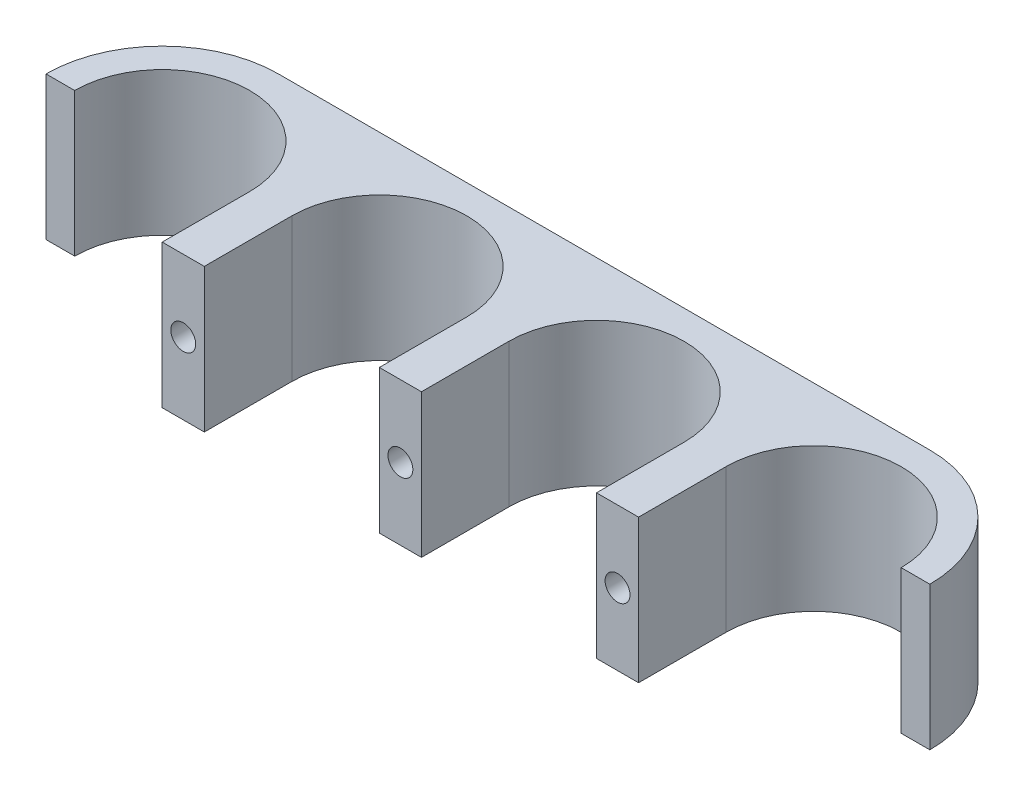
ISO-10303-21;
HEADER;
FILE_DESCRIPTION(('STEP AP214'),'2;1');
FILE_NAME('part.step','',(''),(''),'','','');
FILE_SCHEMA(('AUTOMOTIVE_DESIGN { 1 0 10303 214 1 1 1 1 }'));
ENDSEC;
DATA;
#1=APPLICATION_CONTEXT('core data for automotive mechanical design processes');
#2=APPLICATION_PROTOCOL_DEFINITION('international standard','automotive_design',2000,#1);
#3=PRODUCT_CONTEXT('',#1,'mechanical');
#4=PRODUCT('Part','Part','',(#3));
#5=PRODUCT_RELATED_PRODUCT_CATEGORY('part','',(#4));
#6=PRODUCT_DEFINITION_FORMATION('','',#4);
#7=PRODUCT_DEFINITION_CONTEXT('part definition',#1,'design');
#8=PRODUCT_DEFINITION('design','',#6,#7);
#9=PRODUCT_DEFINITION_SHAPE('','',#8);
#10=(LENGTH_UNIT() NAMED_UNIT(*) SI_UNIT(.MILLI.,.METRE.));
#11=(NAMED_UNIT(*) PLANE_ANGLE_UNIT() SI_UNIT($,.RADIAN.));
#12=(NAMED_UNIT(*) SI_UNIT($,.STERADIAN.) SOLID_ANGLE_UNIT());
#13=UNCERTAINTY_MEASURE_WITH_UNIT(LENGTH_MEASURE(1.E-05),#10,'distance_accuracy_value','');
#14=(GEOMETRIC_REPRESENTATION_CONTEXT(3) GLOBAL_UNCERTAINTY_ASSIGNED_CONTEXT((#13)) GLOBAL_UNIT_ASSIGNED_CONTEXT((#10,
#11,#12)) REPRESENTATION_CONTEXT('',''));
#15=CARTESIAN_POINT('',(0.,0.,0.));
#16=DIRECTION('',(0.,0.,1.));
#17=DIRECTION('',(1.,0.,0.));
#18=AXIS2_PLACEMENT_3D('',#15,#16,#17);
#19=CARTESIAN_POINT('',(11.35,15.,0.));
#20=DIRECTION('',(0.,-1.,0.));
#21=DIRECTION('',(0.,0.,-1.));
#22=AXIS2_PLACEMENT_3D('',#19,#20,#21);
#23=CYLINDRICAL_SURFACE('',#22,9.15);
#24=CARTESIAN_POINT('',(11.35,0.,0.));
#25=DIRECTION('',(0.,-1.,0.));
#26=DIRECTION('',(0.,0.,-1.));
#27=AXIS2_PLACEMENT_3D('',#24,#25,#26);
#28=CIRCLE('',#27,9.15);
#29=CARTESIAN_POINT('',(2.2,0.,0.));
#30=VERTEX_POINT('',#29);
#31=CARTESIAN_POINT('',(20.5,0.,0.));
#32=VERTEX_POINT('',#31);
#33=EDGE_CURVE('E189',#30,#32,#28,.T.);
#34=ORIENTED_EDGE('',*,*,#33,.T.);
#35=DIRECTION('',(0.,-1.,0.));
#36=VECTOR('',#35,1.);
#37=CARTESIAN_POINT('',(20.5,15.,0.));
#38=LINE('',#37,#36);
#39=CARTESIAN_POINT('',(20.5,15.,0.));
#40=VERTEX_POINT('',#39);
#41=EDGE_CURVE('E11',#40,#32,#38,.T.);
#42=ORIENTED_EDGE('',*,*,#41,.F.);
#43=CARTESIAN_POINT('',(11.35,15.,0.));
#44=DIRECTION('',(0.,-1.,0.));
#45=DIRECTION('',(0.,0.,-1.));
#46=AXIS2_PLACEMENT_3D('',#43,#44,#45);
#47=CIRCLE('',#46,9.15);
#48=CARTESIAN_POINT('',(2.2,15.,0.));
#49=VERTEX_POINT('',#48);
#50=EDGE_CURVE('E224',#49,#40,#47,.T.);
#51=ORIENTED_EDGE('',*,*,#50,.F.);
#52=DIRECTION('',(0.,-1.,0.));
#53=VECTOR('',#52,1.);
#54=CARTESIAN_POINT('',(2.2,15.,0.));
#55=LINE('',#54,#53);
#56=EDGE_CURVE('E185',#49,#30,#55,.T.);
#57=ORIENTED_EDGE('',*,*,#56,.T.);
#58=EDGE_LOOP('',(#34,#42,#51,#57));
#59=FACE_BOUND('',#58,.T.);
#60=ADVANCED_FACE('F33',(#59),#23,.F.);
#61=CARTESIAN_POINT('',(20.5,15.,0.));
#62=DIRECTION('',(1.,0.,0.));
#63=DIRECTION('',(0.,0.,-1.));
#64=AXIS2_PLACEMENT_3D('',#61,#62,#63);
#65=PLANE('',#64);
#66=DIRECTION('',(0.,0.,1.));
#67=VECTOR('',#66,1.);
#68=CARTESIAN_POINT('',(20.5,0.,0.));
#69=LINE('',#68,#67);
#70=CARTESIAN_POINT('',(20.5,0.,9.15));
#71=VERTEX_POINT('',#70);
#72=EDGE_CURVE('E192',#32,#71,#69,.T.);
#73=ORIENTED_EDGE('',*,*,#72,.T.);
#74=DIRECTION('',(0.,-1.,0.));
#75=VECTOR('',#74,1.);
#76=CARTESIAN_POINT('',(20.5,15.,9.15));
#77=LINE('',#76,#75);
#78=CARTESIAN_POINT('',(20.5,15.,9.15));
#79=VERTEX_POINT('',#78);
#80=EDGE_CURVE('E41',#79,#71,#77,.T.);
#81=ORIENTED_EDGE('',*,*,#80,.F.);
#82=DIRECTION('',(0.,0.,1.));
#83=VECTOR('',#82,1.);
#84=CARTESIAN_POINT('',(20.5,15.,0.));
#85=LINE('',#84,#83);
#86=EDGE_CURVE('E122',#40,#79,#85,.T.);
#87=ORIENTED_EDGE('',*,*,#86,.F.);
#88=ORIENTED_EDGE('',*,*,#41,.T.);
#89=EDGE_LOOP('',(#73,#81,#87,#88));
#90=FACE_BOUND('',#89,.T.);
#91=ADVANCED_FACE('F333',(#90),#65,.F.);
#92=CARTESIAN_POINT('',(20.5,15.,9.15));
#93=DIRECTION('',(0.,0.,-1.));
#94=DIRECTION('',(-1.,0.,0.));
#95=AXIS2_PLACEMENT_3D('',#92,#93,#94);
#96=PLANE('',#95);
#97=CARTESIAN_POINT('',(22.7,7.5,9.15));
#98=DIRECTION('',(0.,0.,-1.));
#99=DIRECTION('',(-1.,0.,0.));
#100=AXIS2_PLACEMENT_3D('',#97,#98,#99);
#101=CIRCLE('',#100,1.3);
#102=CARTESIAN_POINT('',(21.4,7.5,9.15));
#103=VERTEX_POINT('',#102);
#104=EDGE_CURVE('E542',#103,#103,#101,.T.);
#105=ORIENTED_EDGE('',*,*,#104,.T.);
#106=EDGE_LOOP('',(#105));
#107=FACE_BOUND('',#106,.T.);
#108=DIRECTION('',(1.,0.,0.));
#109=VECTOR('',#108,1.);
#110=CARTESIAN_POINT('',(20.5,0.,9.15));
#111=LINE('',#110,#109);
#112=CARTESIAN_POINT('',(24.9,0.,9.15));
#113=VERTEX_POINT('',#112);
#114=EDGE_CURVE('E195',#71,#113,#111,.T.);
#115=ORIENTED_EDGE('',*,*,#114,.T.);
#116=DIRECTION('',(0.,-1.,0.));
#117=VECTOR('',#116,1.);
#118=CARTESIAN_POINT('',(24.9,15.,9.15));
#119=LINE('',#118,#117);
#120=CARTESIAN_POINT('',(24.9,15.,9.15));
#121=VERTEX_POINT('',#120);
#122=EDGE_CURVE('E261',#121,#113,#119,.T.);
#123=ORIENTED_EDGE('',*,*,#122,.F.);
#124=DIRECTION('',(1.,0.,0.));
#125=VECTOR('',#124,1.);
#126=CARTESIAN_POINT('',(20.5,15.,9.15));
#127=LINE('',#126,#125);
#128=EDGE_CURVE('E269',#79,#121,#127,.T.);
#129=ORIENTED_EDGE('',*,*,#128,.F.);
#130=ORIENTED_EDGE('',*,*,#80,.T.);
#131=EDGE_LOOP('',(#115,#123,#129,#130));
#132=FACE_BOUND('',#131,.T.);
#133=ADVANCED_FACE('F267',(#107,#132),#96,.F.);
#134=CARTESIAN_POINT('',(24.9,15.,9.15));
#135=DIRECTION('',(-1.,0.,0.));
#136=DIRECTION('',(0.,0.,1.));
#137=AXIS2_PLACEMENT_3D('',#134,#135,#136);
#138=PLANE('',#137);
#139=DIRECTION('',(0.,0.,-1.));
#140=VECTOR('',#139,1.);
#141=CARTESIAN_POINT('',(24.9,0.,9.15));
#142=LINE('',#141,#140);
#143=CARTESIAN_POINT('',(24.9,0.,0.));
#144=VERTEX_POINT('',#143);
#145=EDGE_CURVE('E197',#113,#144,#142,.T.);
#146=ORIENTED_EDGE('',*,*,#145,.T.);
#147=DIRECTION('',(0.,-1.,0.));
#148=VECTOR('',#147,1.);
#149=CARTESIAN_POINT('',(24.9,15.,0.));
#150=LINE('',#149,#148);
#151=CARTESIAN_POINT('',(24.9,15.,0.));
#152=VERTEX_POINT('',#151);
#153=EDGE_CURVE('E258',#152,#144,#150,.T.);
#154=ORIENTED_EDGE('',*,*,#153,.F.);
#155=DIRECTION('',(0.,0.,-1.));
#156=VECTOR('',#155,1.);
#157=CARTESIAN_POINT('',(24.9,15.,9.15));
#158=LINE('',#157,#156);
#159=EDGE_CURVE('E287',#121,#152,#158,.T.);
#160=ORIENTED_EDGE('',*,*,#159,.F.);
#161=ORIENTED_EDGE('',*,*,#122,.T.);
#162=EDGE_LOOP('',(#146,#154,#160,#161));
#163=FACE_BOUND('',#162,.T.);
#164=ADVANCED_FACE('F278',(#163),#138,.F.);
#165=CARTESIAN_POINT('',(34.05,15.,0.));
#166=DIRECTION('',(0.,-1.,0.));
#167=DIRECTION('',(0.,0.,-1.));
#168=AXIS2_PLACEMENT_3D('',#165,#166,#167);
#169=CYLINDRICAL_SURFACE('',#168,9.15);
#170=CARTESIAN_POINT('',(34.05,0.,0.));
#171=DIRECTION('',(0.,-1.,0.));
#172=DIRECTION('',(0.,0.,-1.));
#173=AXIS2_PLACEMENT_3D('',#170,#171,#172);
#174=CIRCLE('',#173,9.15);
#175=CARTESIAN_POINT('',(43.2,0.,0.));
#176=VERTEX_POINT('',#175);
#177=EDGE_CURVE('E199',#144,#176,#174,.T.);
#178=ORIENTED_EDGE('',*,*,#177,.T.);
#179=DIRECTION('',(0.,-1.,0.));
#180=VECTOR('',#179,1.);
#181=CARTESIAN_POINT('',(43.2,15.,0.));
#182=LINE('',#181,#180);
#183=CARTESIAN_POINT('',(43.2,15.,0.));
#184=VERTEX_POINT('',#183);
#185=EDGE_CURVE('E255',#184,#176,#182,.T.);
#186=ORIENTED_EDGE('',*,*,#185,.F.);
#187=CARTESIAN_POINT('',(34.05,15.,0.));
#188=DIRECTION('',(0.,-1.,0.));
#189=DIRECTION('',(0.,0.,-1.));
#190=AXIS2_PLACEMENT_3D('',#187,#188,#189);
#191=CIRCLE('',#190,9.15);
#192=EDGE_CURVE('E284',#152,#184,#191,.T.);
#193=ORIENTED_EDGE('',*,*,#192,.F.);
#194=ORIENTED_EDGE('',*,*,#153,.T.);
#195=EDGE_LOOP('',(#178,#186,#193,#194));
#196=FACE_BOUND('',#195,.T.);
#197=ADVANCED_FACE('F282',(#196),#169,.F.);
#198=CARTESIAN_POINT('',(43.2,15.,0.));
#199=DIRECTION('',(0.,0.,-1.));
#200=DIRECTION('',(-1.,0.,0.));
#201=AXIS2_PLACEMENT_3D('',#198,#199,#200);
#202=PLANE('',#201);
#203=DIRECTION('',(1.,0.,0.));
#204=VECTOR('',#203,1.);
#205=CARTESIAN_POINT('',(43.2,0.,0.));
#206=LINE('',#205,#204);
#207=CARTESIAN_POINT('',(46.2,0.,0.));
#208=VERTEX_POINT('',#207);
#209=EDGE_CURVE('E201',#176,#208,#206,.T.);
#210=ORIENTED_EDGE('',*,*,#209,.T.);
#211=DIRECTION('',(0.,-1.,0.));
#212=VECTOR('',#211,1.);
#213=CARTESIAN_POINT('',(46.2,15.,0.));
#214=LINE('',#213,#212);
#215=CARTESIAN_POINT('',(46.2,15.,0.));
#216=VERTEX_POINT('',#215);
#217=EDGE_CURVE('E252',#216,#208,#214,.T.);
#218=ORIENTED_EDGE('',*,*,#217,.F.);
#219=DIRECTION('',(1.,0.,0.));
#220=VECTOR('',#219,1.);
#221=CARTESIAN_POINT('',(43.2,15.,0.));
#222=LINE('',#221,#220);
#223=EDGE_CURVE('E286',#184,#216,#222,.T.);
#224=ORIENTED_EDGE('',*,*,#223,.F.);
#225=ORIENTED_EDGE('',*,*,#185,.T.);
#226=EDGE_LOOP('',(#210,#218,#224,#225));
#227=FACE_BOUND('',#226,.T.);
#228=ADVANCED_FACE('F347',(#227),#202,.F.);
#229=CARTESIAN_POINT('',(34.05,15.,0.));
#230=DIRECTION('',(0.,-1.,0.));
#231=DIRECTION('',(0.,0.,-1.));
#232=AXIS2_PLACEMENT_3D('',#229,#230,#231);
#233=CYLINDRICAL_SURFACE('',#232,12.15);
#234=CARTESIAN_POINT('',(34.05,0.,0.));
#235=DIRECTION('',(0.,1.,0.));
#236=DIRECTION('',(0.,0.,1.));
#237=AXIS2_PLACEMENT_3D('',#234,#235,#236);
#238=CIRCLE('',#237,12.15);
#239=CARTESIAN_POINT('',(34.05,0.,-12.15));
#240=VERTEX_POINT('',#239);
#241=EDGE_CURVE('E203',#208,#240,#238,.T.);
#242=ORIENTED_EDGE('',*,*,#241,.T.);
#243=DIRECTION('',(0.,-1.,0.));
#244=VECTOR('',#243,1.);
#245=CARTESIAN_POINT('',(34.05,15.,-12.15));
#246=LINE('',#245,#244);
#247=CARTESIAN_POINT('',(34.05,15.,-12.15));
#248=VERTEX_POINT('',#247);
#249=EDGE_CURVE('E249',#248,#240,#246,.T.);
#250=ORIENTED_EDGE('',*,*,#249,.F.);
#251=CARTESIAN_POINT('',(34.05,15.,0.));
#252=DIRECTION('',(0.,1.,0.));
#253=DIRECTION('',(0.,0.,1.));
#254=AXIS2_PLACEMENT_3D('',#251,#252,#253);
#255=CIRCLE('',#254,12.15);
#256=EDGE_CURVE('E289',#216,#248,#255,.T.);
#257=ORIENTED_EDGE('',*,*,#256,.F.);
#258=ORIENTED_EDGE('',*,*,#217,.T.);
#259=EDGE_LOOP('',(#242,#250,#257,#258));
#260=FACE_BOUND('',#259,.T.);
#261=ADVANCED_FACE('F350',(#260),#233,.T.);
#262=CARTESIAN_POINT('',(34.05,15.,-12.15));
#263=DIRECTION('',(0.,0.,1.));
#264=DIRECTION('',(1.,0.,0.));
#265=AXIS2_PLACEMENT_3D('',#262,#263,#264);
#266=PLANE('',#265);
#267=CARTESIAN_POINT('',(0.,7.5,-12.15));
#268=DIRECTION('',(0.,0.,-1.));
#269=DIRECTION('',(-1.,0.,0.));
#270=AXIS2_PLACEMENT_3D('',#267,#268,#269);
#271=CIRCLE('',#270,1.29999999999999);
#272=CARTESIAN_POINT('',(-1.29999999999999,7.5,-12.15));
#273=VERTEX_POINT('',#272);
#274=EDGE_CURVE('E535',#273,#273,#271,.T.);
#275=ORIENTED_EDGE('',*,*,#274,.F.);
#276=EDGE_LOOP('',(#275));
#277=FACE_BOUND('',#276,.T.);
#278=CARTESIAN_POINT('',(22.7,7.5,-12.15));
#279=DIRECTION('',(0.,0.,-1.));
#280=DIRECTION('',(-1.,0.,0.));
#281=AXIS2_PLACEMENT_3D('',#278,#279,#280);
#282=CIRCLE('',#281,1.29999999999999);
#283=CARTESIAN_POINT('',(21.4,7.5,-12.15));
#284=VERTEX_POINT('',#283);
#285=EDGE_CURVE('E537',#284,#284,#282,.T.);
#286=ORIENTED_EDGE('',*,*,#285,.F.);
#287=EDGE_LOOP('',(#286));
#288=FACE_BOUND('',#287,.T.);
#289=CARTESIAN_POINT('',(-22.7,7.5,-12.15));
#290=DIRECTION('',(0.,0.,-1.));
#291=DIRECTION('',(-1.,0.,0.));
#292=AXIS2_PLACEMENT_3D('',#289,#290,#291);
#293=CIRCLE('',#292,1.29999999999999);
#294=CARTESIAN_POINT('',(-24.,7.5,-12.15));
#295=VERTEX_POINT('',#294);
#296=EDGE_CURVE('E545',#295,#295,#293,.T.);
#297=ORIENTED_EDGE('',*,*,#296,.F.);
#298=EDGE_LOOP('',(#297));
#299=FACE_BOUND('',#298,.T.);
#300=DIRECTION('',(-1.,0.,0.));
#301=VECTOR('',#300,1.);
#302=CARTESIAN_POINT('',(34.05,0.,-12.15));
#303=LINE('',#302,#301);
#304=CARTESIAN_POINT('',(-34.05,0.,-12.15));
#305=VERTEX_POINT('',#304);
#306=EDGE_CURVE('E205',#240,#305,#303,.T.);
#307=ORIENTED_EDGE('',*,*,#306,.T.);
#308=DIRECTION('',(0.,-1.,0.));
#309=VECTOR('',#308,1.);
#310=CARTESIAN_POINT('',(-34.05,15.,-12.15));
#311=LINE('',#310,#309);
#312=CARTESIAN_POINT('',(-34.05,15.,-12.15));
#313=VERTEX_POINT('',#312);
#314=EDGE_CURVE('E246',#313,#305,#311,.T.);
#315=ORIENTED_EDGE('',*,*,#314,.F.);
#316=DIRECTION('',(-1.,0.,0.));
#317=VECTOR('',#316,1.);
#318=CARTESIAN_POINT('',(34.05,15.,-12.15));
#319=LINE('',#318,#317);
#320=EDGE_CURVE('E295',#248,#313,#319,.T.);
#321=ORIENTED_EDGE('',*,*,#320,.F.);
#322=ORIENTED_EDGE('',*,*,#249,.T.);
#323=EDGE_LOOP('',(#307,#315,#321,#322));
#324=FACE_BOUND('',#323,.T.);
#325=ADVANCED_FACE('F354',(#277,#288,#299,#324),#266,.F.);
#326=CARTESIAN_POINT('',(-34.05,15.,0.));
#327=DIRECTION('',(0.,-1.,0.));
#328=DIRECTION('',(0.,0.,-1.));
#329=AXIS2_PLACEMENT_3D('',#326,#327,#328);
#330=CYLINDRICAL_SURFACE('',#329,12.15);
#331=CARTESIAN_POINT('',(-34.05,0.,0.));
#332=DIRECTION('',(0.,1.,0.));
#333=DIRECTION('',(0.,0.,-1.));
#334=AXIS2_PLACEMENT_3D('',#331,#332,#333);
#335=CIRCLE('',#334,12.15);
#336=CARTESIAN_POINT('',(-46.2,0.,0.));
#337=VERTEX_POINT('',#336);
#338=EDGE_CURVE('E207',#305,#337,#335,.T.);
#339=ORIENTED_EDGE('',*,*,#338,.T.);
#340=DIRECTION('',(0.,-1.,0.));
#341=VECTOR('',#340,1.);
#342=CARTESIAN_POINT('',(-46.2,15.,0.));
#343=LINE('',#342,#341);
#344=CARTESIAN_POINT('',(-46.2,15.,0.));
#345=VERTEX_POINT('',#344);
#346=EDGE_CURVE('E243',#345,#337,#343,.T.);
#347=ORIENTED_EDGE('',*,*,#346,.F.);
#348=CARTESIAN_POINT('',(-34.05,15.,0.));
#349=DIRECTION('',(0.,1.,0.));
#350=DIRECTION('',(0.,0.,-1.));
#351=AXIS2_PLACEMENT_3D('',#348,#349,#350);
#352=CIRCLE('',#351,12.15);
#353=EDGE_CURVE('E297',#313,#345,#352,.T.);
#354=ORIENTED_EDGE('',*,*,#353,.F.);
#355=ORIENTED_EDGE('',*,*,#314,.T.);
#356=EDGE_LOOP('',(#339,#347,#354,#355));
#357=FACE_BOUND('',#356,.T.);
#358=ADVANCED_FACE('F358',(#357),#330,.T.);
#359=CARTESIAN_POINT('',(-43.2,15.,0.));
#360=DIRECTION('',(0.,0.,-1.));
#361=DIRECTION('',(-1.,0.,0.));
#362=AXIS2_PLACEMENT_3D('',#359,#360,#361);
#363=PLANE('',#362);
#364=DIRECTION('',(1.,0.,0.));
#365=VECTOR('',#364,1.);
#366=CARTESIAN_POINT('',(-43.2,0.,0.));
#367=LINE('',#366,#365);
#368=CARTESIAN_POINT('',(-43.2,0.,0.));
#369=VERTEX_POINT('',#368);
#370=EDGE_CURVE('E209',#337,#369,#367,.T.);
#371=ORIENTED_EDGE('',*,*,#370,.T.);
#372=DIRECTION('',(0.,-1.,0.));
#373=VECTOR('',#372,1.);
#374=CARTESIAN_POINT('',(-43.2,15.,0.));
#375=LINE('',#374,#373);
#376=CARTESIAN_POINT('',(-43.2,15.,0.));
#377=VERTEX_POINT('',#376);
#378=EDGE_CURVE('E240',#377,#369,#375,.T.);
#379=ORIENTED_EDGE('',*,*,#378,.F.);
#380=DIRECTION('',(1.,0.,0.));
#381=VECTOR('',#380,1.);
#382=CARTESIAN_POINT('',(-43.2,15.,0.));
#383=LINE('',#382,#381);
#384=EDGE_CURVE('E299',#345,#377,#383,.T.);
#385=ORIENTED_EDGE('',*,*,#384,.F.);
#386=ORIENTED_EDGE('',*,*,#346,.T.);
#387=EDGE_LOOP('',(#371,#379,#385,#386));
#388=FACE_BOUND('',#387,.T.);
#389=ADVANCED_FACE('F362',(#388),#363,.F.);
#390=CARTESIAN_POINT('',(-34.05,15.,0.));
#391=DIRECTION('',(0.,-1.,0.));
#392=DIRECTION('',(0.,0.,-1.));
#393=AXIS2_PLACEMENT_3D('',#390,#391,#392);
#394=CYLINDRICAL_SURFACE('',#393,9.15);
#395=CARTESIAN_POINT('',(-34.05,0.,0.));
#396=DIRECTION('',(0.,-1.,0.));
#397=DIRECTION('',(0.,0.,1.));
#398=AXIS2_PLACEMENT_3D('',#395,#396,#397);
#399=CIRCLE('',#398,9.15);
#400=CARTESIAN_POINT('',(-24.9,0.,0.));
#401=VERTEX_POINT('',#400);
#402=EDGE_CURVE('E211',#369,#401,#399,.T.);
#403=ORIENTED_EDGE('',*,*,#402,.T.);
#404=DIRECTION('',(0.,-1.,0.));
#405=VECTOR('',#404,1.);
#406=CARTESIAN_POINT('',(-24.9,15.,0.));
#407=LINE('',#406,#405);
#408=CARTESIAN_POINT('',(-24.9,15.,0.));
#409=VERTEX_POINT('',#408);
#410=EDGE_CURVE('E237',#409,#401,#407,.T.);
#411=ORIENTED_EDGE('',*,*,#410,.F.);
#412=CARTESIAN_POINT('',(-34.05,15.,0.));
#413=DIRECTION('',(0.,-1.,0.));
#414=DIRECTION('',(0.,0.,1.));
#415=AXIS2_PLACEMENT_3D('',#412,#413,#414);
#416=CIRCLE('',#415,9.15);
#417=EDGE_CURVE('E301',#377,#409,#416,.T.);
#418=ORIENTED_EDGE('',*,*,#417,.F.);
#419=ORIENTED_EDGE('',*,*,#378,.T.);
#420=EDGE_LOOP('',(#403,#411,#418,#419));
#421=FACE_BOUND('',#420,.T.);
#422=ADVANCED_FACE('F366',(#421),#394,.F.);
#423=CARTESIAN_POINT('',(-24.9,15.,9.15));
#424=DIRECTION('',(1.,0.,0.));
#425=DIRECTION('',(0.,0.,-1.));
#426=AXIS2_PLACEMENT_3D('',#423,#424,#425);
#427=PLANE('',#426);
#428=DIRECTION('',(0.,0.,1.));
#429=VECTOR('',#428,1.);
#430=CARTESIAN_POINT('',(-24.9,0.,9.15));
#431=LINE('',#430,#429);
#432=CARTESIAN_POINT('',(-24.9,0.,9.15));
#433=VERTEX_POINT('',#432);
#434=EDGE_CURVE('E213',#401,#433,#431,.T.);
#435=ORIENTED_EDGE('',*,*,#434,.T.);
#436=DIRECTION('',(0.,-1.,0.));
#437=VECTOR('',#436,1.);
#438=CARTESIAN_POINT('',(-24.9,15.,9.15));
#439=LINE('',#438,#437);
#440=CARTESIAN_POINT('',(-24.9,15.,9.15));
#441=VERTEX_POINT('',#440);
#442=EDGE_CURVE('E234',#441,#433,#439,.T.);
#443=ORIENTED_EDGE('',*,*,#442,.F.);
#444=DIRECTION('',(0.,0.,1.));
#445=VECTOR('',#444,1.);
#446=CARTESIAN_POINT('',(-24.9,15.,9.15));
#447=LINE('',#446,#445);
#448=EDGE_CURVE('E303',#409,#441,#447,.T.);
#449=ORIENTED_EDGE('',*,*,#448,.F.);
#450=ORIENTED_EDGE('',*,*,#410,.T.);
#451=EDGE_LOOP('',(#435,#443,#449,#450));
#452=FACE_BOUND('',#451,.T.);
#453=ADVANCED_FACE('F370',(#452),#427,.F.);
#454=CARTESIAN_POINT('',(-20.5,15.,9.15));
#455=DIRECTION('',(0.,0.,-1.));
#456=DIRECTION('',(-1.,0.,0.));
#457=AXIS2_PLACEMENT_3D('',#454,#455,#456);
#458=PLANE('',#457);
#459=CARTESIAN_POINT('',(-22.7,7.5,9.15));
#460=DIRECTION('',(0.,0.,-1.));
#461=DIRECTION('',(-1.,0.,0.));
#462=AXIS2_PLACEMENT_3D('',#459,#460,#461);
#463=CIRCLE('',#462,1.3);
#464=CARTESIAN_POINT('',(-24.,7.5,9.15));
#465=VERTEX_POINT('',#464);
#466=EDGE_CURVE('E193',#465,#465,#463,.T.);
#467=ORIENTED_EDGE('',*,*,#466,.T.);
#468=EDGE_LOOP('',(#467));
#469=FACE_BOUND('',#468,.T.);
#470=DIRECTION('',(1.,0.,0.));
#471=VECTOR('',#470,1.);
#472=CARTESIAN_POINT('',(-20.5,0.,9.15));
#473=LINE('',#472,#471);
#474=CARTESIAN_POINT('',(-20.5,0.,9.15));
#475=VERTEX_POINT('',#474);
#476=EDGE_CURVE('E215',#433,#475,#473,.T.);
#477=ORIENTED_EDGE('',*,*,#476,.T.);
#478=DIRECTION('',(0.,-1.,0.));
#479=VECTOR('',#478,1.);
#480=CARTESIAN_POINT('',(-20.5,15.,9.15));
#481=LINE('',#480,#479);
#482=CARTESIAN_POINT('',(-20.5,15.,9.15));
#483=VERTEX_POINT('',#482);
#484=EDGE_CURVE('E231',#483,#475,#481,.T.);
#485=ORIENTED_EDGE('',*,*,#484,.F.);
#486=DIRECTION('',(1.,0.,0.));
#487=VECTOR('',#486,1.);
#488=CARTESIAN_POINT('',(-20.5,15.,9.15));
#489=LINE('',#488,#487);
#490=EDGE_CURVE('E305',#441,#483,#489,.T.);
#491=ORIENTED_EDGE('',*,*,#490,.F.);
#492=ORIENTED_EDGE('',*,*,#442,.T.);
#493=EDGE_LOOP('',(#477,#485,#491,#492));
#494=FACE_BOUND('',#493,.T.);
#495=ADVANCED_FACE('F374',(#469,#494),#458,.F.);
#496=CARTESIAN_POINT('',(-20.5,15.,0.));
#497=DIRECTION('',(-1.,0.,0.));
#498=DIRECTION('',(0.,0.,1.));
#499=AXIS2_PLACEMENT_3D('',#496,#497,#498);
#500=PLANE('',#499);
#501=DIRECTION('',(0.,0.,-1.));
#502=VECTOR('',#501,1.);
#503=CARTESIAN_POINT('',(-20.5,0.,0.));
#504=LINE('',#503,#502);
#505=CARTESIAN_POINT('',(-20.5,0.,0.));
#506=VERTEX_POINT('',#505);
#507=EDGE_CURVE('E217',#475,#506,#504,.T.);
#508=ORIENTED_EDGE('',*,*,#507,.T.);
#509=DIRECTION('',(0.,-1.,0.));
#510=VECTOR('',#509,1.);
#511=CARTESIAN_POINT('',(-20.5,15.,0.));
#512=LINE('',#511,#510);
#513=CARTESIAN_POINT('',(-20.5,15.,0.));
#514=VERTEX_POINT('',#513);
#515=EDGE_CURVE('E228',#514,#506,#512,.T.);
#516=ORIENTED_EDGE('',*,*,#515,.F.);
#517=DIRECTION('',(0.,0.,-1.));
#518=VECTOR('',#517,1.);
#519=CARTESIAN_POINT('',(-20.5,15.,0.));
#520=LINE('',#519,#518);
#521=EDGE_CURVE('E307',#483,#514,#520,.T.);
#522=ORIENTED_EDGE('',*,*,#521,.F.);
#523=ORIENTED_EDGE('',*,*,#484,.T.);
#524=EDGE_LOOP('',(#508,#516,#522,#523));
#525=FACE_BOUND('',#524,.T.);
#526=ADVANCED_FACE('F313',(#525),#500,.F.);
#527=CARTESIAN_POINT('',(-11.35,15.,0.));
#528=DIRECTION('',(0.,-1.,0.));
#529=DIRECTION('',(0.,0.,-1.));
#530=AXIS2_PLACEMENT_3D('',#527,#528,#529);
#531=CYLINDRICAL_SURFACE('',#530,9.15);
#532=CARTESIAN_POINT('',(-11.35,0.,0.));
#533=DIRECTION('',(0.,-1.,0.));
#534=DIRECTION('',(0.,0.,1.));
#535=AXIS2_PLACEMENT_3D('',#532,#533,#534);
#536=CIRCLE('',#535,9.15);
#537=CARTESIAN_POINT('',(-2.2,0.,0.));
#538=VERTEX_POINT('',#537);
#539=EDGE_CURVE('E219',#506,#538,#536,.T.);
#540=ORIENTED_EDGE('',*,*,#539,.T.);
#541=DIRECTION('',(0.,-1.,0.));
#542=VECTOR('',#541,1.);
#543=CARTESIAN_POINT('',(-2.2,15.,0.));
#544=LINE('',#543,#542);
#545=CARTESIAN_POINT('',(-2.2,15.,0.));
#546=VERTEX_POINT('',#545);
#547=EDGE_CURVE('E180',#546,#538,#544,.T.);
#548=ORIENTED_EDGE('',*,*,#547,.F.);
#549=CARTESIAN_POINT('',(-11.35,15.,0.));
#550=DIRECTION('',(0.,-1.,0.));
#551=DIRECTION('',(0.,0.,1.));
#552=AXIS2_PLACEMENT_3D('',#549,#550,#551);
#553=CIRCLE('',#552,9.15);
#554=EDGE_CURVE('E171',#514,#546,#553,.T.);
#555=ORIENTED_EDGE('',*,*,#554,.F.);
#556=ORIENTED_EDGE('',*,*,#515,.T.);
#557=EDGE_LOOP('',(#540,#548,#555,#556));
#558=FACE_BOUND('',#557,.T.);
#559=ADVANCED_FACE('F317',(#558),#531,.F.);
#560=CARTESIAN_POINT('',(-2.2,15.,0.));
#561=DIRECTION('',(1.,0.,0.));
#562=DIRECTION('',(0.,0.,-1.));
#563=AXIS2_PLACEMENT_3D('',#560,#561,#562);
#564=PLANE('',#563);
#565=DIRECTION('',(0.,0.,1.));
#566=VECTOR('',#565,1.);
#567=CARTESIAN_POINT('',(-2.2,0.,0.));
#568=LINE('',#567,#566);
#569=CARTESIAN_POINT('',(-2.2,0.,9.15));
#570=VERTEX_POINT('',#569);
#571=EDGE_CURVE('E179',#538,#570,#568,.T.);
#572=ORIENTED_EDGE('',*,*,#571,.T.);
#573=DIRECTION('',(0.,-1.,0.));
#574=VECTOR('',#573,1.);
#575=CARTESIAN_POINT('',(-2.2,15.,9.15));
#576=LINE('',#575,#574);
#577=CARTESIAN_POINT('',(-2.2,15.,9.15));
#578=VERTEX_POINT('',#577);
#579=EDGE_CURVE('E176',#578,#570,#576,.T.);
#580=ORIENTED_EDGE('',*,*,#579,.F.);
#581=DIRECTION('',(0.,0.,1.));
#582=VECTOR('',#581,1.);
#583=CARTESIAN_POINT('',(-2.2,15.,0.));
#584=LINE('',#583,#582);
#585=EDGE_CURVE('E165',#546,#578,#584,.T.);
#586=ORIENTED_EDGE('',*,*,#585,.F.);
#587=ORIENTED_EDGE('',*,*,#547,.T.);
#588=EDGE_LOOP('',(#572,#580,#586,#587));
#589=FACE_BOUND('',#588,.T.);
#590=ADVANCED_FACE('F177',(#589),#564,.F.);
#591=CARTESIAN_POINT('',(2.2,15.,9.15));
#592=DIRECTION('',(0.,0.,-1.));
#593=DIRECTION('',(-1.,0.,0.));
#594=AXIS2_PLACEMENT_3D('',#591,#592,#593);
#595=PLANE('',#594);
#596=CARTESIAN_POINT('',(0.,7.5,9.15));
#597=DIRECTION('',(0.,0.,-1.));
#598=DIRECTION('',(-1.,0.,0.));
#599=AXIS2_PLACEMENT_3D('',#596,#597,#598);
#600=CIRCLE('',#599,1.29999999999999);
#601=CARTESIAN_POINT('',(-1.29999999999999,7.5,9.15));
#602=VERTEX_POINT('',#601);
#603=EDGE_CURVE('E532',#602,#602,#600,.T.);
#604=ORIENTED_EDGE('',*,*,#603,.T.);
#605=EDGE_LOOP('',(#604));
#606=FACE_BOUND('',#605,.T.);
#607=DIRECTION('',(1.,0.,0.));
#608=VECTOR('',#607,1.);
#609=CARTESIAN_POINT('',(2.2,0.,9.15));
#610=LINE('',#609,#608);
#611=CARTESIAN_POINT('',(2.2,0.,9.15));
#612=VERTEX_POINT('',#611);
#613=EDGE_CURVE('E108',#570,#612,#610,.T.);
#614=ORIENTED_EDGE('',*,*,#613,.T.);
#615=DIRECTION('',(0.,-1.,0.));
#616=VECTOR('',#615,1.);
#617=CARTESIAN_POINT('',(2.2,15.,9.15));
#618=LINE('',#617,#616);
#619=CARTESIAN_POINT('',(2.2,15.,9.15));
#620=VERTEX_POINT('',#619);
#621=EDGE_CURVE('E181',#620,#612,#618,.T.);
#622=ORIENTED_EDGE('',*,*,#621,.F.);
#623=DIRECTION('',(1.,0.,0.));
#624=VECTOR('',#623,1.);
#625=CARTESIAN_POINT('',(2.2,15.,9.15));
#626=LINE('',#625,#624);
#627=EDGE_CURVE('E169',#578,#620,#626,.T.);
#628=ORIENTED_EDGE('',*,*,#627,.F.);
#629=ORIENTED_EDGE('',*,*,#579,.T.);
#630=EDGE_LOOP('',(#614,#622,#628,#629));
#631=FACE_BOUND('',#630,.T.);
#632=ADVANCED_FACE('F183',(#606,#631),#595,.F.);
#633=CARTESIAN_POINT('',(2.2,15.,0.));
#634=DIRECTION('',(-1.,0.,0.));
#635=DIRECTION('',(0.,0.,1.));
#636=AXIS2_PLACEMENT_3D('',#633,#634,#635);
#637=PLANE('',#636);
#638=DIRECTION('',(0.,0.,-1.));
#639=VECTOR('',#638,1.);
#640=CARTESIAN_POINT('',(2.2,0.,0.));
#641=LINE('',#640,#639);
#642=EDGE_CURVE('E114',#612,#30,#641,.T.);
#643=ORIENTED_EDGE('',*,*,#642,.T.);
#644=ORIENTED_EDGE('',*,*,#56,.F.);
#645=DIRECTION('',(0.,0.,-1.));
#646=VECTOR('',#645,1.);
#647=CARTESIAN_POINT('',(2.2,15.,0.));
#648=LINE('',#647,#646);
#649=EDGE_CURVE('E49',#620,#49,#648,.T.);
#650=ORIENTED_EDGE('',*,*,#649,.F.);
#651=ORIENTED_EDGE('',*,*,#621,.T.);
#652=EDGE_LOOP('',(#643,#644,#650,#651));
#653=FACE_BOUND('',#652,.T.);
#654=ADVANCED_FACE('F321',(#653),#637,.F.);
#655=CARTESIAN_POINT('',(11.35,15.,0.));
#656=DIRECTION('',(0.,-1.,0.));
#657=DIRECTION('',(0.,0.,-1.));
#658=AXIS2_PLACEMENT_3D('',#655,#656,#657);
#659=PLANE('',#658);
#660=ORIENTED_EDGE('',*,*,#50,.T.);
#661=ORIENTED_EDGE('',*,*,#86,.T.);
#662=ORIENTED_EDGE('',*,*,#128,.T.);
#663=ORIENTED_EDGE('',*,*,#159,.T.);
#664=ORIENTED_EDGE('',*,*,#192,.T.);
#665=ORIENTED_EDGE('',*,*,#223,.T.);
#666=ORIENTED_EDGE('',*,*,#256,.T.);
#667=ORIENTED_EDGE('',*,*,#320,.T.);
#668=ORIENTED_EDGE('',*,*,#353,.T.);
#669=ORIENTED_EDGE('',*,*,#384,.T.);
#670=ORIENTED_EDGE('',*,*,#417,.T.);
#671=ORIENTED_EDGE('',*,*,#448,.T.);
#672=ORIENTED_EDGE('',*,*,#490,.T.);
#673=ORIENTED_EDGE('',*,*,#521,.T.);
#674=ORIENTED_EDGE('',*,*,#554,.T.);
#675=ORIENTED_EDGE('',*,*,#585,.T.);
#676=ORIENTED_EDGE('',*,*,#627,.T.);
#677=ORIENTED_EDGE('',*,*,#649,.T.);
#678=EDGE_LOOP('',(#660,#661,#662,#663,#664,#665,#666,#667,#668,#669,#670,#671,#672,#673,#674,
#675,#676,#677));
#679=FACE_BOUND('',#678,.T.);
#680=ADVANCED_FACE('F167',(#679),#659,.F.);
#681=CARTESIAN_POINT('',(11.35,0.,0.));
#682=DIRECTION('',(0.,-1.,0.));
#683=DIRECTION('',(0.,0.,-1.));
#684=AXIS2_PLACEMENT_3D('',#681,#682,#683);
#685=PLANE('',#684);
#686=ORIENTED_EDGE('',*,*,#33,.F.);
#687=ORIENTED_EDGE('',*,*,#642,.F.);
#688=ORIENTED_EDGE('',*,*,#613,.F.);
#689=ORIENTED_EDGE('',*,*,#571,.F.);
#690=ORIENTED_EDGE('',*,*,#539,.F.);
#691=ORIENTED_EDGE('',*,*,#507,.F.);
#692=ORIENTED_EDGE('',*,*,#476,.F.);
#693=ORIENTED_EDGE('',*,*,#434,.F.);
#694=ORIENTED_EDGE('',*,*,#402,.F.);
#695=ORIENTED_EDGE('',*,*,#370,.F.);
#696=ORIENTED_EDGE('',*,*,#338,.F.);
#697=ORIENTED_EDGE('',*,*,#306,.F.);
#698=ORIENTED_EDGE('',*,*,#241,.F.);
#699=ORIENTED_EDGE('',*,*,#209,.F.);
#700=ORIENTED_EDGE('',*,*,#177,.F.);
#701=ORIENTED_EDGE('',*,*,#145,.F.);
#702=ORIENTED_EDGE('',*,*,#114,.F.);
#703=ORIENTED_EDGE('',*,*,#72,.F.);
#704=EDGE_LOOP('',(#686,#687,#688,#689,#690,#691,#692,#693,#694,#695,#696,#697,#698,#699,#700,
#701,#702,#703));
#705=FACE_BOUND('',#704,.T.);
#706=ADVANCED_FACE('F273',(#705),#685,.T.);
#707=CARTESIAN_POINT('',(-22.7,7.5,-12.15));
#708=DIRECTION('',(0.,0.,-1.));
#709=DIRECTION('',(-1.,0.,0.));
#710=AXIS2_PLACEMENT_3D('',#707,#708,#709);
#711=CYLINDRICAL_SURFACE('',#710,1.29999999999999);
#712=ORIENTED_EDGE('',*,*,#466,.F.);
#713=EDGE_LOOP('',(#712));
#714=FACE_BOUND('',#713,.T.);
#715=ORIENTED_EDGE('',*,*,#296,.T.);
#716=EDGE_LOOP('',(#715));
#717=FACE_BOUND('',#716,.T.);
#718=ADVANCED_FACE('F402',(#714,#717),#711,.F.);
#719=CARTESIAN_POINT('',(22.7,7.5,-12.15));
#720=DIRECTION('',(0.,0.,-1.));
#721=DIRECTION('',(-1.,0.,0.));
#722=AXIS2_PLACEMENT_3D('',#719,#720,#721);
#723=CYLINDRICAL_SURFACE('',#722,1.29999999999999);
#724=ORIENTED_EDGE('',*,*,#104,.F.);
#725=EDGE_LOOP('',(#724));
#726=FACE_BOUND('',#725,.T.);
#727=ORIENTED_EDGE('',*,*,#285,.T.);
#728=EDGE_LOOP('',(#727));
#729=FACE_BOUND('',#728,.T.);
#730=ADVANCED_FACE('F407',(#726,#729),#723,.F.);
#731=CARTESIAN_POINT('',(0.,7.5,-12.15));
#732=DIRECTION('',(0.,0.,-1.));
#733=DIRECTION('',(-1.,0.,0.));
#734=AXIS2_PLACEMENT_3D('',#731,#732,#733);
#735=CYLINDRICAL_SURFACE('',#734,1.29999999999999);
#736=ORIENTED_EDGE('',*,*,#603,.F.);
#737=EDGE_LOOP('',(#736));
#738=FACE_BOUND('',#737,.T.);
#739=ORIENTED_EDGE('',*,*,#274,.T.);
#740=EDGE_LOOP('',(#739));
#741=FACE_BOUND('',#740,.T.);
#742=ADVANCED_FACE('F419',(#738,#741),#735,.F.);
#743=CLOSED_SHELL('',(#60,#91,#133,#164,#197,#228,#261,#325,#358,#389,#422,#453,#495,#526,#559,
#590,#632,#654,#680,#706,#718,#730,#742));
#744=MANIFOLD_SOLID_BREP('B2',#743);
#745=ADVANCED_BREP_SHAPE_REPRESENTATION('',(#18,#744),#14);
#746=SHAPE_DEFINITION_REPRESENTATION(#9,#745);
ENDSEC;
END-ISO-10303-21;
